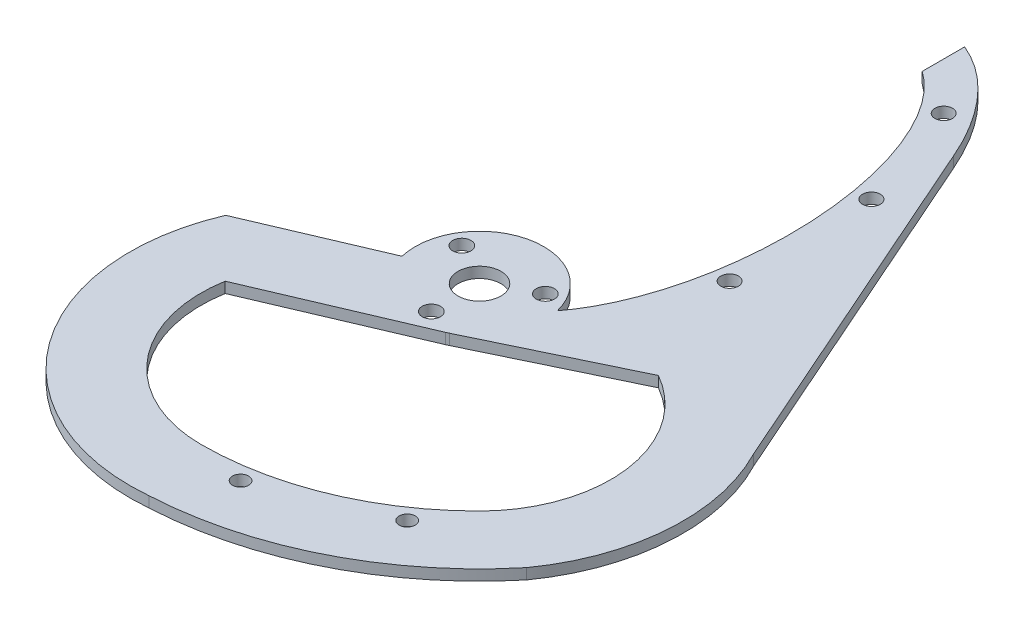
ISO-10303-21;
HEADER;
FILE_DESCRIPTION(('STEP AP214'),'2;1');
FILE_NAME('part.step','',(''),(''),'','','');
FILE_SCHEMA(('AUTOMOTIVE_DESIGN { 1 0 10303 214 1 1 1 1 }'));
ENDSEC;
DATA;
#1=APPLICATION_CONTEXT('core data for automotive mechanical design processes');
#2=APPLICATION_PROTOCOL_DEFINITION('international standard','automotive_design',2000,#1);
#3=PRODUCT_CONTEXT('',#1,'mechanical');
#4=PRODUCT('Part','Part','',(#3));
#5=PRODUCT_RELATED_PRODUCT_CATEGORY('part','',(#4));
#6=PRODUCT_DEFINITION_FORMATION('','',#4);
#7=PRODUCT_DEFINITION_CONTEXT('part definition',#1,'design');
#8=PRODUCT_DEFINITION('design','',#6,#7);
#9=PRODUCT_DEFINITION_SHAPE('','',#8);
#10=(LENGTH_UNIT() NAMED_UNIT(*) SI_UNIT(.MILLI.,.METRE.));
#11=(NAMED_UNIT(*) PLANE_ANGLE_UNIT() SI_UNIT($,.RADIAN.));
#12=(NAMED_UNIT(*) SI_UNIT($,.STERADIAN.) SOLID_ANGLE_UNIT());
#13=UNCERTAINTY_MEASURE_WITH_UNIT(LENGTH_MEASURE(1.E-05),#10,'distance_accuracy_value','');
#14=(GEOMETRIC_REPRESENTATION_CONTEXT(3) GLOBAL_UNCERTAINTY_ASSIGNED_CONTEXT((#13)) GLOBAL_UNIT_ASSIGNED_CONTEXT((#10,
#11,#12)) REPRESENTATION_CONTEXT('',''));
#15=CARTESIAN_POINT('',(0.,0.,0.));
#16=DIRECTION('',(0.,0.,1.));
#17=DIRECTION('',(1.,0.,0.));
#18=AXIS2_PLACEMENT_3D('',#15,#16,#17);
#19=CARTESIAN_POINT('',(0.,2.,-37.));
#20=DIRECTION('',(0.,1.,0.));
#21=DIRECTION('',(0.,0.,1.));
#22=AXIS2_PLACEMENT_3D('',#19,#20,#21);
#23=PLANE('',#22);
#24=CARTESIAN_POINT('',(15.7972211019033,2.,-70.8772499778511));
#25=DIRECTION('',(0.,-1.,0.));
#26=DIRECTION('',(0.,0.,-1.));
#27=AXIS2_PLACEMENT_3D('',#24,#25,#26);
#28=CIRCLE('',#27,1.65);
#29=CARTESIAN_POINT('',(15.7972211019033,2.,-72.5272499778511));
#30=VERTEX_POINT('',#29);
#31=EDGE_CURVE('E553',#30,#30,#28,.T.);
#32=ORIENTED_EDGE('',*,*,#31,.T.);
#33=EDGE_LOOP('',(#32));
#34=FACE_BOUND('',#33,.T.);
#35=CARTESIAN_POINT('',(22.937226804426,2.,-50.2428140699979));
#36=DIRECTION('',(0.,-1.,0.));
#37=DIRECTION('',(0.,0.,-1.));
#38=AXIS2_PLACEMENT_3D('',#35,#36,#37);
#39=CIRCLE('',#38,1.64999999999966);
#40=CARTESIAN_POINT('',(22.937226804426,2.,-51.8928140699975));
#41=VERTEX_POINT('',#40);
#42=EDGE_CURVE('E557',#41,#41,#39,.T.);
#43=ORIENTED_EDGE('',*,*,#42,.T.);
#44=EDGE_LOOP('',(#43));
#45=FACE_BOUND('',#44,.T.);
#46=CARTESIAN_POINT('',(22.9372268044259,2.,-23.7571859300015));
#47=DIRECTION('',(0.,-1.,0.));
#48=DIRECTION('',(0.,0.,-1.));
#49=AXIS2_PLACEMENT_3D('',#46,#47,#48);
#50=CIRCLE('',#49,1.65000000000007);
#51=CARTESIAN_POINT('',(22.9372268044259,2.,-25.4071859300015));
#52=VERTEX_POINT('',#51);
#53=EDGE_CURVE('E567',#52,#52,#50,.T.);
#54=ORIENTED_EDGE('',*,*,#53,.T.);
#55=EDGE_LOOP('',(#54));
#56=FACE_BOUND('',#55,.T.);
#57=CARTESIAN_POINT('',(-7.79422863405993,2.,-4.50000000000003));
#58=DIRECTION('',(0.,1.,0.));
#59=DIRECTION('',(0.,0.,1.));
#60=AXIS2_PLACEMENT_3D('',#57,#58,#59);
#61=CIRCLE('',#60,1.7);
#62=CARTESIAN_POINT('',(-7.79422863405993,2.,-2.80000000000003));
#63=VERTEX_POINT('',#62);
#64=EDGE_CURVE('E579',#63,#63,#61,.T.);
#65=ORIENTED_EDGE('',*,*,#64,.F.);
#66=EDGE_LOOP('',(#65));
#67=FACE_BOUND('',#66,.T.);
#68=CARTESIAN_POINT('',(0.,2.,0.));
#69=DIRECTION('',(0.,1.,0.));
#70=DIRECTION('',(0.,0.,1.));
#71=AXIS2_PLACEMENT_3D('',#68,#69,#70);
#72=CIRCLE('',#71,4.);
#73=CARTESIAN_POINT('',(0.,2.,4.));
#74=VERTEX_POINT('',#73);
#75=EDGE_CURVE('E177',#74,#74,#72,.T.);
#76=ORIENTED_EDGE('',*,*,#75,.F.);
#77=EDGE_LOOP('',(#76));
#78=FACE_BOUND('',#77,.T.);
#79=CARTESIAN_POINT('',(9.55064977168081,2.,54.1644264156715));
#80=DIRECTION('',(0.,1.,0.));
#81=DIRECTION('',(0.,0.,1.));
#82=AXIS2_PLACEMENT_3D('',#79,#80,#81);
#83=CIRCLE('',#82,1.5);
#84=CARTESIAN_POINT('',(9.55064977168081,2.,55.6644264156715));
#85=VERTEX_POINT('',#84);
#86=EDGE_CURVE('E203',#85,#85,#83,.T.);
#87=ORIENTED_EDGE('',*,*,#86,.F.);
#88=EDGE_LOOP('',(#87));
#89=FACE_BOUND('',#88,.T.);
#90=CARTESIAN_POINT('',(0.,2.,27.5));
#91=DIRECTION('',(0.,1.,0.));
#92=DIRECTION('',(0.,0.,1.));
#93=AXIS2_PLACEMENT_3D('',#90,#91,#92);
#94=CIRCLE('',#93,37.7960440045201);
#95=CARTESIAN_POINT('',(-34.7530259638295,2.,12.6417319734428));
#96=VERTEX_POINT('',#95);
#97=CARTESIAN_POINT('',(3.46521608342593,2.,65.1368598568848));
#98=VERTEX_POINT('',#97);
#99=EDGE_CURVE('E209',#96,#98,#94,.T.);
#100=ORIENTED_EDGE('',*,*,#99,.T.);
#101=CARTESIAN_POINT('',(0.,2.,0.));
#102=DIRECTION('',(0.,1.,0.));
#103=DIRECTION('',(0.,0.,-1.));
#104=AXIS2_PLACEMENT_3D('',#101,#102,#103);
#105=CIRCLE('',#104,65.2289677560537);
#106=CARTESIAN_POINT('',(50.3204734868398,2.,41.5050380385386));
#107=VERTEX_POINT('',#106);
#108=EDGE_CURVE('E212',#98,#107,#105,.T.);
#109=ORIENTED_EDGE('',*,*,#108,.T.);
#110=CARTESIAN_POINT('',(19.4454364826301,2.,19.44543648263));
#111=DIRECTION('',(0.,1.,0.));
#112=DIRECTION('',(0.,0.,1.));
#113=AXIS2_PLACEMENT_3D('',#110,#111,#112);
#114=CIRCLE('',#113,37.945934312081);
#115=CARTESIAN_POINT('',(53.1014027201686,2.,1.91917426176751));
#116=VERTEX_POINT('',#115);
#117=EDGE_CURVE('E215',#107,#116,#114,.T.);
#118=ORIENTED_EDGE('',*,*,#117,.T.);
#119=DIRECTION('',(-0.403922440341298,0.,-0.914793234664933));
#120=VECTOR('',#119,1.);
#121=CARTESIAN_POINT('',(53.1014027201686,2.,1.91917426176751));
#122=LINE('',#121,#120);
#123=CARTESIAN_POINT('',(23.6105645658982,2.,-64.8709233751198));
#124=VERTEX_POINT('',#123);
#125=EDGE_CURVE('E217',#116,#124,#122,.T.);
#126=ORIENTED_EDGE('',*,*,#125,.T.);
#127=CARTESIAN_POINT('',(0.,2.,-37.));
#128=DIRECTION('',(0.,1.,0.));
#129=DIRECTION('',(0.,0.,-1.));
#130=AXIS2_PLACEMENT_3D('',#127,#128,#129);
#131=ELLIPSE('',#130,48.,29.);
#132=CARTESIAN_POINT('',(6.99999999999944,2.,-83.5806806492812));
#133=VERTEX_POINT('',#132);
#134=EDGE_CURVE('E219',#124,#133,#131,.T.);
#135=ORIENTED_EDGE('',*,*,#134,.T.);
#136=DIRECTION('',(0.,0.,1.));
#137=VECTOR('',#136,1.);
#138=CARTESIAN_POINT('',(6.99999999999944,2.,-83.5806806492812));
#139=LINE('',#138,#137);
#140=CARTESIAN_POINT('',(7.,2.,-75.6551707048646));
#141=VERTEX_POINT('',#140);
#142=EDGE_CURVE('E222',#133,#141,#139,.T.);
#143=ORIENTED_EDGE('',*,*,#142,.T.);
#144=CARTESIAN_POINT('',(0.,2.,-37.));
#145=DIRECTION('',(0.,-1.,0.));
#146=DIRECTION('',(0.,0.,-1.));
#147=AXIS2_PLACEMENT_3D('',#144,#145,#146);
#148=ELLIPSE('',#147,41.,21.);
#149=CARTESIAN_POINT('',(11.6480242475121,2.,-2.88505305510178));
#150=VERTEX_POINT('',#149);
#151=EDGE_CURVE('E271',#141,#150,#148,.T.);
#152=ORIENTED_EDGE('',*,*,#151,.T.);
#153=CARTESIAN_POINT('',(0.,2.,0.));
#154=DIRECTION('',(0.,1.,0.));
#155=DIRECTION('',(0.,0.,1.));
#156=AXIS2_PLACEMENT_3D('',#153,#154,#155);
#157=CIRCLE('',#156,12.0000000000288);
#158=CARTESIAN_POINT('',(-11.6686622102127,2.,2.80041465226931));
#159=VERTEX_POINT('',#158);
#160=EDGE_CURVE('E274',#150,#159,#157,.T.);
#161=ORIENTED_EDGE('',*,*,#160,.T.);
#162=DIRECTION('',(-0.919893360350413,0.,0.392168593315714));
#163=VECTOR('',#162,1.);
#164=CARTESIAN_POINT('',(-34.7530259638295,2.,12.6417319734428));
#165=LINE('',#164,#163);
#166=EDGE_CURVE('E276',#159,#96,#165,.T.);
#167=ORIENTED_EDGE('',*,*,#166,.T.);
#168=EDGE_LOOP('',(#100,#109,#118,#126,#135,#143,#152,#161,#167));
#169=FACE_BOUND('',#168,.T.);
#170=CARTESIAN_POINT('',(31.5467039993079,2.,45.0533624358943));
#171=DIRECTION('',(0.,1.,0.));
#172=DIRECTION('',(0.,0.,-1.));
#173=AXIS2_PLACEMENT_3D('',#170,#171,#172);
#174=CIRCLE('',#173,1.5);
#175=CARTESIAN_POINT('',(31.5467039993079,2.,43.5533624358943));
#176=VERTEX_POINT('',#175);
#177=EDGE_CURVE('E197',#176,#176,#174,.T.);
#178=ORIENTED_EDGE('',*,*,#177,.F.);
#179=EDGE_LOOP('',(#178));
#180=FACE_BOUND('',#179,.T.);
#181=CARTESIAN_POINT('',(0.,2.,0.));
#182=DIRECTION('',(0.,1.,0.));
#183=DIRECTION('',(0.,0.,1.));
#184=AXIS2_PLACEMENT_3D('',#181,#182,#183);
#185=CIRCLE('',#184,52.);
#186=CARTESIAN_POINT('',(0.,2.,52.));
#187=VERTEX_POINT('',#186);
#188=CARTESIAN_POINT('',(36.7695526217005,2.,36.7695526217005));
#189=VERTEX_POINT('',#188);
#190=EDGE_CURVE('E151',#187,#189,#185,.T.);
#191=ORIENTED_EDGE('',*,*,#190,.F.);
#192=CARTESIAN_POINT('',(0.,2.,27.5));
#193=DIRECTION('',(0.,1.,0.));
#194=DIRECTION('',(0.,0.,-1.));
#195=AXIS2_PLACEMENT_3D('',#192,#193,#194);
#196=CIRCLE('',#195,24.5);
#197=CARTESIAN_POINT('',(-24.1438982496382,2.,23.3380080116465));
#198=VERTEX_POINT('',#197);
#199=EDGE_CURVE('E143',#198,#187,#196,.T.);
#200=ORIENTED_EDGE('',*,*,#199,.F.);
#201=DIRECTION('',(-0.919893360350413,0.,0.392168593315714));
#202=VECTOR('',#201,1.);
#203=CARTESIAN_POINT('',(4.70602311978857,2.,11.0387203242049));
#204=LINE('',#203,#202);
#205=CARTESIAN_POINT('',(4.70602311978857,2.,11.0387203242049));
#206=VERTEX_POINT('',#205);
#207=EDGE_CURVE('E174',#206,#198,#204,.T.);
#208=ORIENTED_EDGE('',*,*,#207,.F.);
#209=CARTESIAN_POINT('',(0.,2.,0.));
#210=DIRECTION('',(0.,-1.,0.));
#211=DIRECTION('',(0.,0.,1.));
#212=AXIS2_PLACEMENT_3D('',#209,#210,#211);
#213=CIRCLE('',#212,12.);
#214=CARTESIAN_POINT('',(5.20136166047983,2.,10.8141498453133));
#215=VERTEX_POINT('',#214);
#216=EDGE_CURVE('E172',#215,#206,#213,.T.);
#217=ORIENTED_EDGE('',*,*,#216,.F.);
#218=DIRECTION('',(-0.901179153776112,0.,0.433446805039986));
#219=VECTOR('',#218,1.);
#220=CARTESIAN_POINT('',(5.20136166047983,2.,10.8141498453133));
#221=LINE('',#220,#219);
#222=CARTESIAN_POINT('',(31.5467039993079,2.,-1.85736437758079));
#223=VERTEX_POINT('',#222);
#224=EDGE_CURVE('E167',#223,#215,#221,.T.);
#225=ORIENTED_EDGE('',*,*,#224,.F.);
#226=CARTESIAN_POINT('',(19.4454364826301,2.,19.44543648263));
#227=DIRECTION('',(0.,1.,0.));
#228=DIRECTION('',(0.,0.,1.));
#229=AXIS2_PLACEMENT_3D('',#226,#227,#228);
#230=CIRCLE('',#229,24.5);
#231=EDGE_CURVE('E165',#189,#223,#230,.T.);
#232=ORIENTED_EDGE('',*,*,#231,.F.);
#233=EDGE_LOOP('',(#191,#200,#208,#217,#225,#232));
#234=FACE_BOUND('',#233,.T.);
#235=CARTESIAN_POINT('',(0.,2.,9.));
#236=DIRECTION('',(0.,1.,0.));
#237=DIRECTION('',(0.,0.,1.));
#238=AXIS2_PLACEMENT_3D('',#235,#236,#237);
#239=CIRCLE('',#238,1.7);
#240=CARTESIAN_POINT('',(0.,2.,10.7));
#241=VERTEX_POINT('',#240);
#242=EDGE_CURVE('E585',#241,#241,#239,.T.);
#243=ORIENTED_EDGE('',*,*,#242,.F.);
#244=EDGE_LOOP('',(#243));
#245=FACE_BOUND('',#244,.T.);
#246=CARTESIAN_POINT('',(7.79422863405999,2.,-4.49999999999993));
#247=DIRECTION('',(0.,1.,0.));
#248=DIRECTION('',(0.,0.,1.));
#249=AXIS2_PLACEMENT_3D('',#246,#247,#248);
#250=CIRCLE('',#249,1.7);
#251=CARTESIAN_POINT('',(7.79422863405999,2.,-2.79999999999993));
#252=VERTEX_POINT('',#251);
#253=EDGE_CURVE('E573',#252,#252,#250,.T.);
#254=ORIENTED_EDGE('',*,*,#253,.F.);
#255=EDGE_LOOP('',(#254));
#256=FACE_BOUND('',#255,.T.);
#257=ADVANCED_FACE('F36',(#34,#45,#56,#67,#78,#89,#169,#180,#234,#245,#256),#23,.T.);
#258=CARTESIAN_POINT('',(0.,0.,-37.));
#259=DIRECTION('',(0.,1.,0.));
#260=DIRECTION('',(0.,0.,1.));
#261=AXIS2_PLACEMENT_3D('',#258,#259,#260);
#262=PLANE('',#261);
#263=CARTESIAN_POINT('',(15.7972211019033,0.,-70.8772499778511));
#264=DIRECTION('',(0.,-1.,0.));
#265=DIRECTION('',(0.,0.,-1.));
#266=AXIS2_PLACEMENT_3D('',#263,#264,#265);
#267=CIRCLE('',#266,1.65);
#268=CARTESIAN_POINT('',(15.7972211019033,0.,-72.5272499778511));
#269=VERTEX_POINT('',#268);
#270=EDGE_CURVE('E556',#269,#269,#267,.T.);
#271=ORIENTED_EDGE('',*,*,#270,.F.);
#272=EDGE_LOOP('',(#271));
#273=FACE_BOUND('',#272,.T.);
#274=CARTESIAN_POINT('',(22.937226804426,0.,-50.2428140699979));
#275=DIRECTION('',(0.,-1.,0.));
#276=DIRECTION('',(0.,0.,-1.));
#277=AXIS2_PLACEMENT_3D('',#274,#275,#276);
#278=CIRCLE('',#277,1.64999999999966);
#279=CARTESIAN_POINT('',(22.937226804426,0.,-51.8928140699975));
#280=VERTEX_POINT('',#279);
#281=EDGE_CURVE('E562',#280,#280,#278,.T.);
#282=ORIENTED_EDGE('',*,*,#281,.F.);
#283=EDGE_LOOP('',(#282));
#284=FACE_BOUND('',#283,.T.);
#285=CARTESIAN_POINT('',(22.9372268044259,0.,-23.7571859300015));
#286=DIRECTION('',(0.,-1.,0.));
#287=DIRECTION('',(0.,0.,-1.));
#288=AXIS2_PLACEMENT_3D('',#285,#286,#287);
#289=CIRCLE('',#288,1.65000000000007);
#290=CARTESIAN_POINT('',(22.9372268044259,0.,-25.4071859300015));
#291=VERTEX_POINT('',#290);
#292=EDGE_CURVE('E559',#291,#291,#289,.T.);
#293=ORIENTED_EDGE('',*,*,#292,.F.);
#294=EDGE_LOOP('',(#293));
#295=FACE_BOUND('',#294,.T.);
#296=CARTESIAN_POINT('',(31.5467039993079,0.,45.0533624358943));
#297=DIRECTION('',(0.,1.,0.));
#298=DIRECTION('',(0.,0.,-1.));
#299=AXIS2_PLACEMENT_3D('',#296,#297,#298);
#300=CIRCLE('',#299,1.5);
#301=CARTESIAN_POINT('',(31.5467039993079,0.,43.5533624358943));
#302=VERTEX_POINT('',#301);
#303=EDGE_CURVE('E159',#302,#302,#300,.T.);
#304=ORIENTED_EDGE('',*,*,#303,.T.);
#305=EDGE_LOOP('',(#304));
#306=FACE_BOUND('',#305,.T.);
#307=CARTESIAN_POINT('',(9.55064977168081,0.,54.1644264156715));
#308=DIRECTION('',(0.,1.,0.));
#309=DIRECTION('',(0.,0.,1.));
#310=AXIS2_PLACEMENT_3D('',#307,#308,#309);
#311=CIRCLE('',#310,1.5);
#312=CARTESIAN_POINT('',(9.55064977168081,0.,55.6644264156715));
#313=VERTEX_POINT('',#312);
#314=EDGE_CURVE('E200',#313,#313,#311,.T.);
#315=ORIENTED_EDGE('',*,*,#314,.T.);
#316=EDGE_LOOP('',(#315));
#317=FACE_BOUND('',#316,.T.);
#318=CARTESIAN_POINT('',(0.,0.,27.5));
#319=DIRECTION('',(0.,1.,0.));
#320=DIRECTION('',(0.,0.,1.));
#321=AXIS2_PLACEMENT_3D('',#318,#319,#320);
#322=CIRCLE('',#321,37.7960440045201);
#323=CARTESIAN_POINT('',(-34.7530259638295,0.,12.6417319734428));
#324=VERTEX_POINT('',#323);
#325=CARTESIAN_POINT('',(3.46521608342593,0.,65.1368598568848));
#326=VERTEX_POINT('',#325);
#327=EDGE_CURVE('E206',#324,#326,#322,.T.);
#328=ORIENTED_EDGE('',*,*,#327,.F.);
#329=DIRECTION('',(-0.919893360350413,0.,0.392168593315714));
#330=VECTOR('',#329,1.);
#331=CARTESIAN_POINT('',(-34.7530259638295,0.,12.6417319734428));
#332=LINE('',#331,#330);
#333=CARTESIAN_POINT('',(-11.6686622102127,0.,2.80041465226931));
#334=VERTEX_POINT('',#333);
#335=EDGE_CURVE('E213',#334,#324,#332,.T.);
#336=ORIENTED_EDGE('',*,*,#335,.F.);
#337=CARTESIAN_POINT('',(0.,0.,0.));
#338=DIRECTION('',(0.,1.,0.));
#339=DIRECTION('',(0.,0.,1.));
#340=AXIS2_PLACEMENT_3D('',#337,#338,#339);
#341=CIRCLE('',#340,12.0000000000288);
#342=CARTESIAN_POINT('',(11.6480242475121,0.,-2.88505305510178));
#343=VERTEX_POINT('',#342);
#344=EDGE_CURVE('E293',#343,#334,#341,.T.);
#345=ORIENTED_EDGE('',*,*,#344,.F.);
#346=CARTESIAN_POINT('',(0.,0.,-37.));
#347=DIRECTION('',(0.,-1.,0.));
#348=DIRECTION('',(0.,0.,-1.));
#349=AXIS2_PLACEMENT_3D('',#346,#347,#348);
#350=ELLIPSE('',#349,41.,21.);
#351=CARTESIAN_POINT('',(7.,0.,-75.6551707048646));
#352=VERTEX_POINT('',#351);
#353=EDGE_CURVE('E291',#352,#343,#350,.T.);
#354=ORIENTED_EDGE('',*,*,#353,.F.);
#355=DIRECTION('',(0.,0.,1.));
#356=VECTOR('',#355,1.);
#357=CARTESIAN_POINT('',(6.99999999999944,0.,-83.5806806492812));
#358=LINE('',#357,#356);
#359=CARTESIAN_POINT('',(6.99999999999944,0.,-83.5806806492812));
#360=VERTEX_POINT('',#359);
#361=EDGE_CURVE('E289',#360,#352,#358,.T.);
#362=ORIENTED_EDGE('',*,*,#361,.F.);
#363=CARTESIAN_POINT('',(0.,0.,-37.));
#364=DIRECTION('',(0.,1.,0.));
#365=DIRECTION('',(0.,0.,-1.));
#366=AXIS2_PLACEMENT_3D('',#363,#364,#365);
#367=ELLIPSE('',#366,48.,29.);
#368=CARTESIAN_POINT('',(23.6105645658982,0.,-64.8709233751198));
#369=VERTEX_POINT('',#368);
#370=EDGE_CURVE('E287',#369,#360,#367,.T.);
#371=ORIENTED_EDGE('',*,*,#370,.F.);
#372=DIRECTION('',(-0.403922440341298,0.,-0.914793234664933));
#373=VECTOR('',#372,1.);
#374=CARTESIAN_POINT('',(53.1014027201686,0.,1.91917426176751));
#375=LINE('',#374,#373);
#376=CARTESIAN_POINT('',(53.1014027201686,0.,1.91917426176751));
#377=VERTEX_POINT('',#376);
#378=EDGE_CURVE('E285',#377,#369,#375,.T.);
#379=ORIENTED_EDGE('',*,*,#378,.F.);
#380=CARTESIAN_POINT('',(19.4454364826301,0.,19.44543648263));
#381=DIRECTION('',(0.,1.,0.));
#382=DIRECTION('',(0.,0.,1.));
#383=AXIS2_PLACEMENT_3D('',#380,#381,#382);
#384=CIRCLE('',#383,37.945934312081);
#385=CARTESIAN_POINT('',(50.3204734868398,0.,41.5050380385386));
#386=VERTEX_POINT('',#385);
#387=EDGE_CURVE('E283',#386,#377,#384,.T.);
#388=ORIENTED_EDGE('',*,*,#387,.F.);
#389=CARTESIAN_POINT('',(0.,0.,0.));
#390=DIRECTION('',(0.,1.,0.));
#391=DIRECTION('',(0.,0.,-1.));
#392=AXIS2_PLACEMENT_3D('',#389,#390,#391);
#393=CIRCLE('',#392,65.2289677560537);
#394=EDGE_CURVE('E281',#326,#386,#393,.T.);
#395=ORIENTED_EDGE('',*,*,#394,.F.);
#396=EDGE_LOOP('',(#328,#336,#345,#354,#362,#371,#379,#388,#395));
#397=FACE_BOUND('',#396,.T.);
#398=CARTESIAN_POINT('',(0.,0.,27.5));
#399=DIRECTION('',(0.,1.,0.));
#400=DIRECTION('',(0.,0.,-1.));
#401=AXIS2_PLACEMENT_3D('',#398,#399,#400);
#402=CIRCLE('',#401,24.5);
#403=CARTESIAN_POINT('',(-24.1438982496382,0.,23.3380080116465));
#404=VERTEX_POINT('',#403);
#405=CARTESIAN_POINT('',(0.,0.,52.));
#406=VERTEX_POINT('',#405);
#407=EDGE_CURVE('E59',#404,#406,#402,.T.);
#408=ORIENTED_EDGE('',*,*,#407,.T.);
#409=CARTESIAN_POINT('',(0.,0.,0.));
#410=DIRECTION('',(0.,1.,0.));
#411=DIRECTION('',(0.,0.,1.));
#412=AXIS2_PLACEMENT_3D('',#409,#410,#411);
#413=CIRCLE('',#412,52.);
#414=CARTESIAN_POINT('',(36.7695526217005,0.,36.7695526217005));
#415=VERTEX_POINT('',#414);
#416=EDGE_CURVE('E158',#406,#415,#413,.T.);
#417=ORIENTED_EDGE('',*,*,#416,.T.);
#418=CARTESIAN_POINT('',(19.4454364826301,0.,19.44543648263));
#419=DIRECTION('',(0.,1.,0.));
#420=DIRECTION('',(0.,0.,1.));
#421=AXIS2_PLACEMENT_3D('',#418,#419,#420);
#422=CIRCLE('',#421,24.5);
#423=CARTESIAN_POINT('',(31.5467039993079,0.,-1.85736437758079));
#424=VERTEX_POINT('',#423);
#425=EDGE_CURVE('E179',#415,#424,#422,.T.);
#426=ORIENTED_EDGE('',*,*,#425,.T.);
#427=DIRECTION('',(-0.901179153776112,0.,0.433446805039986));
#428=VECTOR('',#427,1.);
#429=CARTESIAN_POINT('',(5.20136166047983,0.,10.8141498453133));
#430=LINE('',#429,#428);
#431=CARTESIAN_POINT('',(5.20136166047983,0.,10.8141498453133));
#432=VERTEX_POINT('',#431);
#433=EDGE_CURVE('E182',#424,#432,#430,.T.);
#434=ORIENTED_EDGE('',*,*,#433,.T.);
#435=CARTESIAN_POINT('',(0.,0.,0.));
#436=DIRECTION('',(0.,-1.,0.));
#437=DIRECTION('',(0.,0.,1.));
#438=AXIS2_PLACEMENT_3D('',#435,#436,#437);
#439=CIRCLE('',#438,12.);
#440=CARTESIAN_POINT('',(4.70602311978857,0.,11.0387203242049));
#441=VERTEX_POINT('',#440);
#442=EDGE_CURVE('E185',#432,#441,#439,.T.);
#443=ORIENTED_EDGE('',*,*,#442,.T.);
#444=DIRECTION('',(-0.919893360350413,0.,0.392168593315714));
#445=VECTOR('',#444,1.);
#446=CARTESIAN_POINT('',(4.70602311978857,0.,11.0387203242049));
#447=LINE('',#446,#445);
#448=EDGE_CURVE('E152',#441,#404,#447,.T.);
#449=ORIENTED_EDGE('',*,*,#448,.T.);
#450=EDGE_LOOP('',(#408,#417,#426,#434,#443,#449));
#451=FACE_BOUND('',#450,.T.);
#452=CARTESIAN_POINT('',(0.,0.,0.));
#453=DIRECTION('',(0.,1.,0.));
#454=DIRECTION('',(0.,0.,1.));
#455=AXIS2_PLACEMENT_3D('',#452,#453,#454);
#456=CIRCLE('',#455,4.);
#457=CARTESIAN_POINT('',(0.,0.,4.));
#458=VERTEX_POINT('',#457);
#459=EDGE_CURVE('E588',#458,#458,#456,.T.);
#460=ORIENTED_EDGE('',*,*,#459,.T.);
#461=EDGE_LOOP('',(#460));
#462=FACE_BOUND('',#461,.T.);
#463=CARTESIAN_POINT('',(0.,0.,9.));
#464=DIRECTION('',(0.,1.,0.));
#465=DIRECTION('',(0.,0.,1.));
#466=AXIS2_PLACEMENT_3D('',#463,#464,#465);
#467=CIRCLE('',#466,1.7);
#468=CARTESIAN_POINT('',(0.,0.,10.7));
#469=VERTEX_POINT('',#468);
#470=EDGE_CURVE('E582',#469,#469,#467,.T.);
#471=ORIENTED_EDGE('',*,*,#470,.T.);
#472=EDGE_LOOP('',(#471));
#473=FACE_BOUND('',#472,.T.);
#474=CARTESIAN_POINT('',(-7.79422863405993,0.,-4.50000000000003));
#475=DIRECTION('',(0.,1.,0.));
#476=DIRECTION('',(0.,0.,1.));
#477=AXIS2_PLACEMENT_3D('',#474,#475,#476);
#478=CIRCLE('',#477,1.7);
#479=CARTESIAN_POINT('',(-7.79422863405993,0.,-2.80000000000003));
#480=VERTEX_POINT('',#479);
#481=EDGE_CURVE('E576',#480,#480,#478,.T.);
#482=ORIENTED_EDGE('',*,*,#481,.T.);
#483=EDGE_LOOP('',(#482));
#484=FACE_BOUND('',#483,.T.);
#485=CARTESIAN_POINT('',(7.79422863405999,0.,-4.49999999999993));
#486=DIRECTION('',(0.,1.,0.));
#487=DIRECTION('',(0.,0.,1.));
#488=AXIS2_PLACEMENT_3D('',#485,#486,#487);
#489=CIRCLE('',#488,1.7);
#490=CARTESIAN_POINT('',(7.79422863405999,0.,-2.79999999999993));
#491=VERTEX_POINT('',#490);
#492=EDGE_CURVE('E570',#491,#491,#489,.T.);
#493=ORIENTED_EDGE('',*,*,#492,.T.);
#494=EDGE_LOOP('',(#493));
#495=FACE_BOUND('',#494,.T.);
#496=ADVANCED_FACE('F245',(#273,#284,#295,#306,#317,#397,#451,#462,#473,#484,#495),#262,.F.);
#497=CARTESIAN_POINT('',(0.,2.,27.5));
#498=DIRECTION('',(0.,-1.,0.));
#499=DIRECTION('',(0.,0.,-1.));
#500=AXIS2_PLACEMENT_3D('',#497,#498,#499);
#501=CYLINDRICAL_SURFACE('',#500,37.7960440045201);
#502=ORIENTED_EDGE('',*,*,#327,.T.);
#503=DIRECTION('',(0.,-1.,0.));
#504=VECTOR('',#503,1.);
#505=CARTESIAN_POINT('',(3.46521608342593,2.,65.1368598568848));
#506=LINE('',#505,#504);
#507=EDGE_CURVE('E11',#98,#326,#506,.T.);
#508=ORIENTED_EDGE('',*,*,#507,.F.);
#509=ORIENTED_EDGE('',*,*,#99,.F.);
#510=DIRECTION('',(0.,-1.,0.));
#511=VECTOR('',#510,1.);
#512=CARTESIAN_POINT('',(-34.7530259638295,2.,12.6417319734428));
#513=LINE('',#512,#511);
#514=EDGE_CURVE('E278',#96,#324,#513,.T.);
#515=ORIENTED_EDGE('',*,*,#514,.T.);
#516=EDGE_LOOP('',(#502,#508,#509,#515));
#517=FACE_BOUND('',#516,.T.);
#518=ADVANCED_FACE('F38',(#517),#501,.T.);
#519=CARTESIAN_POINT('',(0.,2.,0.));
#520=DIRECTION('',(0.,-1.,0.));
#521=DIRECTION('',(0.,0.,-1.));
#522=AXIS2_PLACEMENT_3D('',#519,#520,#521);
#523=CYLINDRICAL_SURFACE('',#522,65.2289677560537);
#524=ORIENTED_EDGE('',*,*,#394,.T.);
#525=DIRECTION('',(0.,-1.,0.));
#526=VECTOR('',#525,1.);
#527=CARTESIAN_POINT('',(50.3204734868398,2.,41.5050380385386));
#528=LINE('',#527,#526);
#529=EDGE_CURVE('E44',#107,#386,#528,.T.);
#530=ORIENTED_EDGE('',*,*,#529,.F.);
#531=ORIENTED_EDGE('',*,*,#108,.F.);
#532=ORIENTED_EDGE('',*,*,#507,.T.);
#533=EDGE_LOOP('',(#524,#530,#531,#532));
#534=FACE_BOUND('',#533,.T.);
#535=ADVANCED_FACE('F238',(#534),#523,.T.);
#536=CARTESIAN_POINT('',(19.4454364826301,2.,19.44543648263));
#537=DIRECTION('',(0.,-1.,0.));
#538=DIRECTION('',(0.,0.,-1.));
#539=AXIS2_PLACEMENT_3D('',#536,#537,#538);
#540=CYLINDRICAL_SURFACE('',#539,37.945934312081);
#541=ORIENTED_EDGE('',*,*,#387,.T.);
#542=DIRECTION('',(0.,-1.,0.));
#543=VECTOR('',#542,1.);
#544=CARTESIAN_POINT('',(53.1014027201686,2.,1.91917426176751));
#545=LINE('',#544,#543);
#546=EDGE_CURVE('E313',#116,#377,#545,.T.);
#547=ORIENTED_EDGE('',*,*,#546,.F.);
#548=ORIENTED_EDGE('',*,*,#117,.F.);
#549=ORIENTED_EDGE('',*,*,#529,.T.);
#550=EDGE_LOOP('',(#541,#547,#548,#549));
#551=FACE_BOUND('',#550,.T.);
#552=ADVANCED_FACE('F235',(#551),#540,.T.);
#553=CARTESIAN_POINT('',(53.1014027201686,2.,1.91917426176751));
#554=DIRECTION('',(-0.914793234664933,0.,0.403922440341298));
#555=DIRECTION('',(0.403922440341298,0.,0.914793234664933));
#556=AXIS2_PLACEMENT_3D('',#553,#554,#555);
#557=PLANE('',#556);
#558=ORIENTED_EDGE('',*,*,#378,.T.);
#559=DIRECTION('',(0.,-1.,0.));
#560=VECTOR('',#559,1.);
#561=CARTESIAN_POINT('',(23.6105645658982,2.,-64.8709233751198));
#562=LINE('',#561,#560);
#563=EDGE_CURVE('E310',#124,#369,#562,.T.);
#564=ORIENTED_EDGE('',*,*,#563,.F.);
#565=ORIENTED_EDGE('',*,*,#125,.F.);
#566=ORIENTED_EDGE('',*,*,#546,.T.);
#567=EDGE_LOOP('',(#558,#564,#565,#566));
#568=FACE_BOUND('',#567,.T.);
#569=ADVANCED_FACE('F230',(#568),#557,.F.);
#570=DIRECTION('',(0.,-1.,0.));
#571=VECTOR('',#570,1.);
#572=SURFACE_OF_LINEAR_EXTRUSION('',#131,#571);
#573=ORIENTED_EDGE('',*,*,#370,.T.);
#574=DIRECTION('',(0.,-1.,0.));
#575=VECTOR('',#574,1.);
#576=CARTESIAN_POINT('',(6.99999999999944,2.,-83.5806806492812));
#577=LINE('',#576,#575);
#578=EDGE_CURVE('E307',#133,#360,#577,.T.);
#579=ORIENTED_EDGE('',*,*,#578,.F.);
#580=ORIENTED_EDGE('',*,*,#134,.F.);
#581=ORIENTED_EDGE('',*,*,#563,.T.);
#582=EDGE_LOOP('',(#573,#579,#580,#581));
#583=FACE_BOUND('',#582,.T.);
#584=ADVANCED_FACE('F225',(#583),#572,.F.);
#585=CARTESIAN_POINT('',(6.99999999999944,2.,-83.5806806492812));
#586=DIRECTION('',(1.,0.,0.));
#587=DIRECTION('',(0.,0.,-1.));
#588=AXIS2_PLACEMENT_3D('',#585,#586,#587);
#589=PLANE('',#588);
#590=ORIENTED_EDGE('',*,*,#361,.T.);
#591=DIRECTION('',(0.,-1.,0.));
#592=VECTOR('',#591,1.);
#593=CARTESIAN_POINT('',(7.,2.,-75.6551707048646));
#594=LINE('',#593,#592);
#595=EDGE_CURVE('E304',#141,#352,#594,.T.);
#596=ORIENTED_EDGE('',*,*,#595,.F.);
#597=ORIENTED_EDGE('',*,*,#142,.F.);
#598=ORIENTED_EDGE('',*,*,#578,.T.);
#599=EDGE_LOOP('',(#590,#596,#597,#598));
#600=FACE_BOUND('',#599,.T.);
#601=ADVANCED_FACE('F229',(#600),#589,.F.);
#602=DIRECTION('',(0.,-1.,0.));
#603=VECTOR('',#602,1.);
#604=SURFACE_OF_LINEAR_EXTRUSION('',#148,#603);
#605=ORIENTED_EDGE('',*,*,#353,.T.);
#606=DIRECTION('',(0.,-1.,0.));
#607=VECTOR('',#606,1.);
#608=CARTESIAN_POINT('',(11.6480242475121,2.,-2.88505305510178));
#609=LINE('',#608,#607);
#610=EDGE_CURVE('E301',#150,#343,#609,.T.);
#611=ORIENTED_EDGE('',*,*,#610,.F.);
#612=ORIENTED_EDGE('',*,*,#151,.F.);
#613=ORIENTED_EDGE('',*,*,#595,.T.);
#614=EDGE_LOOP('',(#605,#611,#612,#613));
#615=FACE_BOUND('',#614,.T.);
#616=ADVANCED_FACE('F267',(#615),#604,.F.);
#617=CARTESIAN_POINT('',(0.,2.,0.));
#618=DIRECTION('',(0.,-1.,0.));
#619=DIRECTION('',(0.,0.,-1.));
#620=AXIS2_PLACEMENT_3D('',#617,#618,#619);
#621=CYLINDRICAL_SURFACE('',#620,12.0000000000288);
#622=ORIENTED_EDGE('',*,*,#344,.T.);
#623=DIRECTION('',(0.,-1.,0.));
#624=VECTOR('',#623,1.);
#625=CARTESIAN_POINT('',(-11.6686622102127,2.,2.80041465226931));
#626=LINE('',#625,#624);
#627=EDGE_CURVE('E298',#159,#334,#626,.T.);
#628=ORIENTED_EDGE('',*,*,#627,.F.);
#629=ORIENTED_EDGE('',*,*,#160,.F.);
#630=ORIENTED_EDGE('',*,*,#610,.T.);
#631=EDGE_LOOP('',(#622,#628,#629,#630));
#632=FACE_BOUND('',#631,.T.);
#633=ADVANCED_FACE('F264',(#632),#621,.T.);
#634=CARTESIAN_POINT('',(-34.7530259638295,2.,12.6417319734428));
#635=DIRECTION('',(0.392168593315714,0.,0.919893360350413));
#636=DIRECTION('',(0.919893360350413,0.,-0.392168593315714));
#637=AXIS2_PLACEMENT_3D('',#634,#635,#636);
#638=PLANE('',#637);
#639=ORIENTED_EDGE('',*,*,#335,.T.);
#640=ORIENTED_EDGE('',*,*,#514,.F.);
#641=ORIENTED_EDGE('',*,*,#166,.F.);
#642=ORIENTED_EDGE('',*,*,#627,.T.);
#643=EDGE_LOOP('',(#639,#640,#641,#642));
#644=FACE_BOUND('',#643,.T.);
#645=ADVANCED_FACE('F261',(#644),#638,.F.);
#646=CARTESIAN_POINT('',(9.55064977168081,2.,54.1644264156715));
#647=DIRECTION('',(0.,-1.,0.));
#648=DIRECTION('',(0.,0.,-1.));
#649=AXIS2_PLACEMENT_3D('',#646,#647,#648);
#650=CYLINDRICAL_SURFACE('',#649,1.5);
#651=ORIENTED_EDGE('',*,*,#86,.T.);
#652=EDGE_LOOP('',(#651));
#653=FACE_BOUND('',#652,.T.);
#654=ORIENTED_EDGE('',*,*,#314,.F.);
#655=EDGE_LOOP('',(#654));
#656=FACE_BOUND('',#655,.T.);
#657=ADVANCED_FACE('F258',(#653,#656),#650,.F.);
#658=CARTESIAN_POINT('',(31.5467039993079,2.,45.0533624358943));
#659=DIRECTION('',(0.,-1.,0.));
#660=DIRECTION('',(0.,0.,-1.));
#661=AXIS2_PLACEMENT_3D('',#658,#659,#660);
#662=CYLINDRICAL_SURFACE('',#661,1.5);
#663=ORIENTED_EDGE('',*,*,#177,.T.);
#664=EDGE_LOOP('',(#663));
#665=FACE_BOUND('',#664,.T.);
#666=ORIENTED_EDGE('',*,*,#303,.F.);
#667=EDGE_LOOP('',(#666));
#668=FACE_BOUND('',#667,.T.);
#669=ADVANCED_FACE('F369',(#665,#668),#662,.F.);
#670=CARTESIAN_POINT('',(0.,2.,27.5));
#671=DIRECTION('',(0.,-1.,0.));
#672=DIRECTION('',(0.,0.,-1.));
#673=AXIS2_PLACEMENT_3D('',#670,#671,#672);
#674=CYLINDRICAL_SURFACE('',#673,24.5);
#675=ORIENTED_EDGE('',*,*,#407,.F.);
#676=DIRECTION('',(0.,-1.,0.));
#677=VECTOR('',#676,1.);
#678=CARTESIAN_POINT('',(-24.1438982496382,2.,23.3380080116465));
#679=LINE('',#678,#677);
#680=EDGE_CURVE('E147',#198,#404,#679,.T.);
#681=ORIENTED_EDGE('',*,*,#680,.F.);
#682=ORIENTED_EDGE('',*,*,#199,.T.);
#683=DIRECTION('',(0.,-1.,0.));
#684=VECTOR('',#683,1.);
#685=CARTESIAN_POINT('',(0.,2.,52.));
#686=LINE('',#685,#684);
#687=EDGE_CURVE('E146',#187,#406,#686,.T.);
#688=ORIENTED_EDGE('',*,*,#687,.T.);
#689=EDGE_LOOP('',(#675,#681,#682,#688));
#690=FACE_BOUND('',#689,.T.);
#691=ADVANCED_FACE('F145',(#690),#674,.F.);
#692=CARTESIAN_POINT('',(0.,2.,0.));
#693=DIRECTION('',(0.,-1.,0.));
#694=DIRECTION('',(0.,0.,-1.));
#695=AXIS2_PLACEMENT_3D('',#692,#693,#694);
#696=CYLINDRICAL_SURFACE('',#695,52.);
#697=ORIENTED_EDGE('',*,*,#416,.F.);
#698=ORIENTED_EDGE('',*,*,#687,.F.);
#699=ORIENTED_EDGE('',*,*,#190,.T.);
#700=DIRECTION('',(0.,-1.,0.));
#701=VECTOR('',#700,1.);
#702=CARTESIAN_POINT('',(36.7695526217005,2.,36.7695526217005));
#703=LINE('',#702,#701);
#704=EDGE_CURVE('E160',#189,#415,#703,.T.);
#705=ORIENTED_EDGE('',*,*,#704,.T.);
#706=EDGE_LOOP('',(#697,#698,#699,#705));
#707=FACE_BOUND('',#706,.T.);
#708=ADVANCED_FACE('F155',(#707),#696,.F.);
#709=CARTESIAN_POINT('',(19.4454364826301,2.,19.44543648263));
#710=DIRECTION('',(0.,-1.,0.));
#711=DIRECTION('',(0.,0.,-1.));
#712=AXIS2_PLACEMENT_3D('',#709,#710,#711);
#713=CYLINDRICAL_SURFACE('',#712,24.5);
#714=ORIENTED_EDGE('',*,*,#425,.F.);
#715=ORIENTED_EDGE('',*,*,#704,.F.);
#716=ORIENTED_EDGE('',*,*,#231,.T.);
#717=DIRECTION('',(0.,-1.,0.));
#718=VECTOR('',#717,1.);
#719=CARTESIAN_POINT('',(31.5467039993079,2.,-1.85736437758079));
#720=LINE('',#719,#718);
#721=EDGE_CURVE('E194',#223,#424,#720,.T.);
#722=ORIENTED_EDGE('',*,*,#721,.T.);
#723=EDGE_LOOP('',(#714,#715,#716,#722));
#724=FACE_BOUND('',#723,.T.);
#725=ADVANCED_FACE('F388',(#724),#713,.F.);
#726=CARTESIAN_POINT('',(5.20136166047983,2.,10.8141498453133));
#727=DIRECTION('',(0.433446805039986,0.,0.901179153776112));
#728=DIRECTION('',(0.901179153776112,0.,-0.433446805039986));
#729=AXIS2_PLACEMENT_3D('',#726,#727,#728);
#730=PLANE('',#729);
#731=ORIENTED_EDGE('',*,*,#433,.F.);
#732=ORIENTED_EDGE('',*,*,#721,.F.);
#733=ORIENTED_EDGE('',*,*,#224,.T.);
#734=DIRECTION('',(0.,-1.,0.));
#735=VECTOR('',#734,1.);
#736=CARTESIAN_POINT('',(5.20136166047983,2.,10.8141498453133));
#737=LINE('',#736,#735);
#738=EDGE_CURVE('E192',#215,#432,#737,.T.);
#739=ORIENTED_EDGE('',*,*,#738,.T.);
#740=EDGE_LOOP('',(#731,#732,#733,#739));
#741=FACE_BOUND('',#740,.T.);
#742=ADVANCED_FACE('F395',(#741),#730,.T.);
#743=CARTESIAN_POINT('',(0.,2.,0.));
#744=DIRECTION('',(0.,-1.,0.));
#745=DIRECTION('',(0.,0.,-1.));
#746=AXIS2_PLACEMENT_3D('',#743,#744,#745);
#747=CYLINDRICAL_SURFACE('',#746,12.);
#748=ORIENTED_EDGE('',*,*,#442,.F.);
#749=ORIENTED_EDGE('',*,*,#738,.F.);
#750=ORIENTED_EDGE('',*,*,#216,.T.);
#751=DIRECTION('',(0.,-1.,0.));
#752=VECTOR('',#751,1.);
#753=CARTESIAN_POINT('',(4.70602311978857,2.,11.0387203242049));
#754=LINE('',#753,#752);
#755=EDGE_CURVE('E51',#206,#441,#754,.T.);
#756=ORIENTED_EDGE('',*,*,#755,.T.);
#757=EDGE_LOOP('',(#748,#749,#750,#756));
#758=FACE_BOUND('',#757,.T.);
#759=ADVANCED_FACE('F403',(#758),#747,.T.);
#760=CARTESIAN_POINT('',(4.70602311978857,2.,11.0387203242049));
#761=DIRECTION('',(0.392168593315714,0.,0.919893360350413));
#762=DIRECTION('',(0.919893360350413,0.,-0.392168593315714));
#763=AXIS2_PLACEMENT_3D('',#760,#761,#762);
#764=PLANE('',#763);
#765=ORIENTED_EDGE('',*,*,#448,.F.);
#766=ORIENTED_EDGE('',*,*,#755,.F.);
#767=ORIENTED_EDGE('',*,*,#207,.T.);
#768=ORIENTED_EDGE('',*,*,#680,.T.);
#769=EDGE_LOOP('',(#765,#766,#767,#768));
#770=FACE_BOUND('',#769,.T.);
#771=ADVANCED_FACE('F411',(#770),#764,.T.);
#772=CARTESIAN_POINT('',(0.,2.,0.));
#773=DIRECTION('',(0.,-1.,0.));
#774=DIRECTION('',(0.,0.,-1.));
#775=AXIS2_PLACEMENT_3D('',#772,#773,#774);
#776=CYLINDRICAL_SURFACE('',#775,4.);
#777=ORIENTED_EDGE('',*,*,#75,.T.);
#778=EDGE_LOOP('',(#777));
#779=FACE_BOUND('',#778,.T.);
#780=ORIENTED_EDGE('',*,*,#459,.F.);
#781=EDGE_LOOP('',(#780));
#782=FACE_BOUND('',#781,.T.);
#783=ADVANCED_FACE('F419',(#779,#782),#776,.F.);
#784=CARTESIAN_POINT('',(0.,2.,9.));
#785=DIRECTION('',(0.,-1.,0.));
#786=DIRECTION('',(0.,0.,-1.));
#787=AXIS2_PLACEMENT_3D('',#784,#785,#786);
#788=CYLINDRICAL_SURFACE('',#787,1.7);
#789=ORIENTED_EDGE('',*,*,#242,.T.);
#790=EDGE_LOOP('',(#789));
#791=FACE_BOUND('',#790,.T.);
#792=ORIENTED_EDGE('',*,*,#470,.F.);
#793=EDGE_LOOP('',(#792));
#794=FACE_BOUND('',#793,.T.);
#795=ADVANCED_FACE('F426',(#791,#794),#788,.F.);
#796=CARTESIAN_POINT('',(-7.79422863405993,2.,-4.50000000000003));
#797=DIRECTION('',(0.,-1.,0.));
#798=DIRECTION('',(0.,0.,-1.));
#799=AXIS2_PLACEMENT_3D('',#796,#797,#798);
#800=CYLINDRICAL_SURFACE('',#799,1.7);
#801=ORIENTED_EDGE('',*,*,#64,.T.);
#802=EDGE_LOOP('',(#801));
#803=FACE_BOUND('',#802,.T.);
#804=ORIENTED_EDGE('',*,*,#481,.F.);
#805=EDGE_LOOP('',(#804));
#806=FACE_BOUND('',#805,.T.);
#807=ADVANCED_FACE('F434',(#803,#806),#800,.F.);
#808=CARTESIAN_POINT('',(7.79422863405999,2.,-4.49999999999993));
#809=DIRECTION('',(0.,-1.,0.));
#810=DIRECTION('',(0.,0.,-1.));
#811=AXIS2_PLACEMENT_3D('',#808,#809,#810);
#812=CYLINDRICAL_SURFACE('',#811,1.7);
#813=ORIENTED_EDGE('',*,*,#253,.T.);
#814=EDGE_LOOP('',(#813));
#815=FACE_BOUND('',#814,.T.);
#816=ORIENTED_EDGE('',*,*,#492,.F.);
#817=EDGE_LOOP('',(#816));
#818=FACE_BOUND('',#817,.T.);
#819=ADVANCED_FACE('F442',(#815,#818),#812,.F.);
#820=CARTESIAN_POINT('',(22.9372268044259,2.,-23.7571859300015));
#821=DIRECTION('',(0.,-1.,0.));
#822=DIRECTION('',(0.,0.,-1.));
#823=AXIS2_PLACEMENT_3D('',#820,#821,#822);
#824=CYLINDRICAL_SURFACE('',#823,1.65000000000007);
#825=ORIENTED_EDGE('',*,*,#53,.F.);
#826=EDGE_LOOP('',(#825));
#827=FACE_BOUND('',#826,.T.);
#828=ORIENTED_EDGE('',*,*,#292,.T.);
#829=EDGE_LOOP('',(#828));
#830=FACE_BOUND('',#829,.T.);
#831=ADVANCED_FACE('F450',(#827,#830),#824,.F.);
#832=CARTESIAN_POINT('',(22.937226804426,2.,-50.2428140699979));
#833=DIRECTION('',(0.,-1.,0.));
#834=DIRECTION('',(0.,0.,-1.));
#835=AXIS2_PLACEMENT_3D('',#832,#833,#834);
#836=CYLINDRICAL_SURFACE('',#835,1.64999999999966);
#837=ORIENTED_EDGE('',*,*,#42,.F.);
#838=EDGE_LOOP('',(#837));
#839=FACE_BOUND('',#838,.T.);
#840=ORIENTED_EDGE('',*,*,#281,.T.);
#841=EDGE_LOOP('',(#840));
#842=FACE_BOUND('',#841,.T.);
#843=ADVANCED_FACE('F458',(#839,#842),#836,.F.);
#844=CARTESIAN_POINT('',(15.7972211019033,2.,-70.8772499778511));
#845=DIRECTION('',(0.,-1.,0.));
#846=DIRECTION('',(0.,0.,-1.));
#847=AXIS2_PLACEMENT_3D('',#844,#845,#846);
#848=CYLINDRICAL_SURFACE('',#847,1.65);
#849=ORIENTED_EDGE('',*,*,#31,.F.);
#850=EDGE_LOOP('',(#849));
#851=FACE_BOUND('',#850,.T.);
#852=ORIENTED_EDGE('',*,*,#270,.T.);
#853=EDGE_LOOP('',(#852));
#854=FACE_BOUND('',#853,.T.);
#855=ADVANCED_FACE('F467',(#851,#854),#848,.F.);
#856=CLOSED_SHELL('',(#257,#496,#518,#535,#552,#569,#584,#601,#616,#633,#645,#657,#669,#691,
#708,#725,#742,#759,#771,#783,#795,#807,#819,#831,#843,#855));
#857=MANIFOLD_SOLID_BREP('B2',#856);
#858=ADVANCED_BREP_SHAPE_REPRESENTATION('',(#18,#857),#14);
#859=SHAPE_DEFINITION_REPRESENTATION(#9,#858);
ENDSEC;
END-ISO-10303-21;
